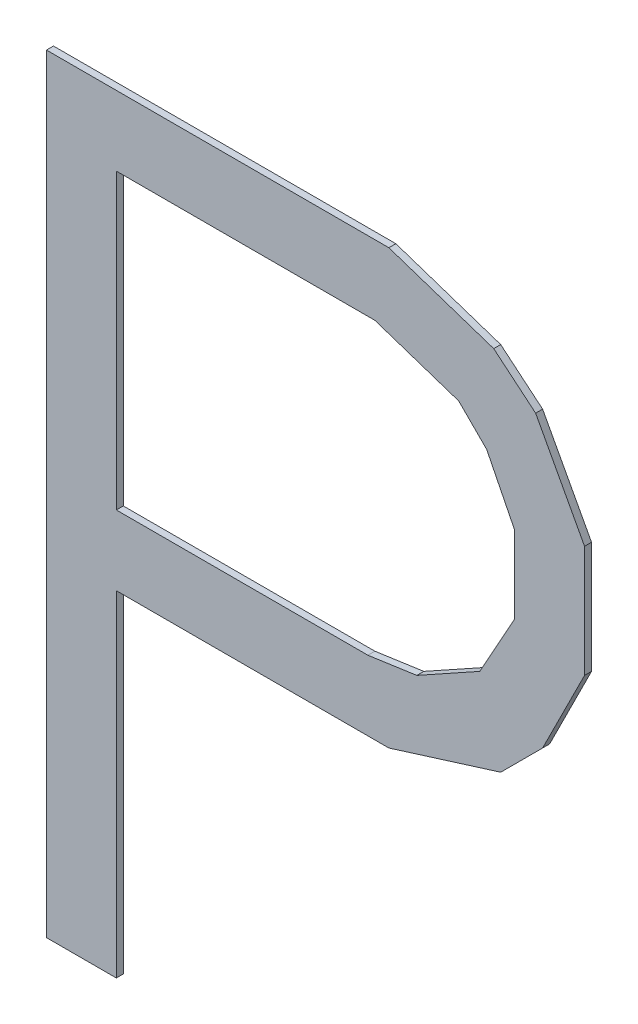
ISO-10303-21;
HEADER;
FILE_DESCRIPTION(('STEP AP214'),'2;1');
FILE_NAME('part.step','',(''),(''),'','','');
FILE_SCHEMA(('AUTOMOTIVE_DESIGN { 1 0 10303 214 1 1 1 1 }'));
ENDSEC;
DATA;
#1=APPLICATION_CONTEXT('core data for automotive mechanical design processes');
#2=APPLICATION_PROTOCOL_DEFINITION('international standard','automotive_design',2000,#1);
#3=PRODUCT_CONTEXT('',#1,'mechanical');
#4=PRODUCT('Part','Part','',(#3));
#5=PRODUCT_RELATED_PRODUCT_CATEGORY('part','',(#4));
#6=PRODUCT_DEFINITION_FORMATION('','',#4);
#7=PRODUCT_DEFINITION_CONTEXT('part definition',#1,'design');
#8=PRODUCT_DEFINITION('design','',#6,#7);
#9=PRODUCT_DEFINITION_SHAPE('','',#8);
#10=(LENGTH_UNIT() NAMED_UNIT(*) SI_UNIT(.MILLI.,.METRE.));
#11=(NAMED_UNIT(*) PLANE_ANGLE_UNIT() SI_UNIT($,.RADIAN.));
#12=(NAMED_UNIT(*) SI_UNIT($,.STERADIAN.) SOLID_ANGLE_UNIT());
#13=UNCERTAINTY_MEASURE_WITH_UNIT(LENGTH_MEASURE(1.E-05),#10,'distance_accuracy_value','');
#14=(GEOMETRIC_REPRESENTATION_CONTEXT(3) GLOBAL_UNCERTAINTY_ASSIGNED_CONTEXT((#13)) GLOBAL_UNIT_ASSIGNED_CONTEXT((#10,
#11,#12)) REPRESENTATION_CONTEXT('',''));
#15=CARTESIAN_POINT('',(0.,0.,0.));
#16=DIRECTION('',(0.,0.,1.));
#17=DIRECTION('',(1.,0.,0.));
#18=AXIS2_PLACEMENT_3D('',#15,#16,#17);
#19=CARTESIAN_POINT('',(-0.28499816,0.03000248000001,0.));
#20=DIRECTION('',(1.,0.,0.));
#21=DIRECTION('',(0.,0.,-1.));
#22=AXIS2_PLACEMENT_3D('',#19,#20,#21);
#23=PLANE('',#22);
#24=DIRECTION('',(0.,0.,1.));
#25=VECTOR('',#24,1.);
#26=CARTESIAN_POINT('',(-0.28499816,-0.06999732,0.));
#27=LINE('',#26,#25);
#28=CARTESIAN_POINT('',(-0.28499816,-0.06999732,0.));
#29=VERTEX_POINT('',#28);
#30=CARTESIAN_POINT('',(-0.28499816,-0.06999732,0.01));
#31=VERTEX_POINT('',#30);
#32=EDGE_CURVE('E189',#29,#31,#27,.T.);
#33=ORIENTED_EDGE('',*,*,#32,.T.);
#34=DIRECTION('',(0.,1.,0.));
#35=VECTOR('',#34,1.);
#36=CARTESIAN_POINT('',(-0.28499816,-0.5499989,0.01));
#37=LINE('',#36,#35);
#38=CARTESIAN_POINT('',(-0.28499816,0.03000248000001,0.01));
#39=VERTEX_POINT('',#38);
#40=EDGE_CURVE('E181',#31,#39,#37,.T.);
#41=ORIENTED_EDGE('',*,*,#40,.T.);
#42=DIRECTION('',(0.,0.,-1.));
#43=VECTOR('',#42,1.);
#44=CARTESIAN_POINT('',(-0.28499816,0.03000248000001,0.));
#45=LINE('',#44,#43);
#46=CARTESIAN_POINT('',(-0.28499816,0.03000248000001,0.));
#47=VERTEX_POINT('',#46);
#48=EDGE_CURVE('E173',#39,#47,#45,.T.);
#49=ORIENTED_EDGE('',*,*,#48,.T.);
#50=DIRECTION('',(0.,1.,0.));
#51=VECTOR('',#50,1.);
#52=CARTESIAN_POINT('',(-0.28499816,-0.5499989,0.));
#53=LINE('',#52,#51);
#54=EDGE_CURVE('E289',#47,#29,#53,.F.);
#55=ORIENTED_EDGE('',*,*,#54,.T.);
#56=EDGE_LOOP('',(#33,#41,#49,#55));
#57=FACE_BOUND('',#56,.T.);
#58=ADVANCED_FACE('F17',(#57),#23,.F.);
#59=CARTESIAN_POINT('',(-0.38499796,-0.5499989,0.01));
#60=DIRECTION('',(0.,0.,-1.));
#61=DIRECTION('',(-1.,0.,0.));
#62=AXIS2_PLACEMENT_3D('',#59,#60,#61);
#63=PLANE('',#62);
#64=DIRECTION('',(-0.707106781186606,-0.707106781186489,0.));
#65=VECTOR('',#64,1.);
#66=CARTESIAN_POINT('',(0.32500062,0.04000245999998,0.01));
#67=LINE('',#66,#65);
#68=CARTESIAN_POINT('',(0.26500074,-0.0199974200000038,0.01));
#69=VERTEX_POINT('',#68);
#70=CARTESIAN_POINT('',(0.325000619999999,0.0400024599999817,0.01));
#71=VERTEX_POINT('',#70);
#72=EDGE_CURVE('E263',#69,#71,#67,.F.);
#73=ORIENTED_EDGE('',*,*,#72,.T.);
#74=DIRECTION('',(-0.447213595499899,-0.894427190999945,0.));
#75=VECTOR('',#74,1.);
#76=CARTESIAN_POINT('',(0.3850005,0.16000222,0.01));
#77=LINE('',#76,#75);
#78=CARTESIAN_POINT('',(0.385000500000002,0.160002219999998,0.01));
#79=VERTEX_POINT('',#78);
#80=EDGE_CURVE('E267',#71,#79,#77,.F.);
#81=ORIENTED_EDGE('',*,*,#80,.T.);
#82=DIRECTION('',(0.,1.,0.));
#83=VECTOR('',#82,1.);
#84=CARTESIAN_POINT('',(0.3850005,-0.5499989,0.01));
#85=LINE('',#84,#83);
#86=CARTESIAN_POINT('',(0.3850005,0.3200019,0.01));
#87=VERTEX_POINT('',#86);
#88=EDGE_CURVE('E270',#79,#87,#85,.T.);
#89=ORIENTED_EDGE('',*,*,#88,.T.);
#90=DIRECTION('',(0.474099823035017,-0.880471099922175,0.));
#91=VECTOR('',#90,1.);
#92=CARTESIAN_POINT('',(0.31500064,0.45000164,0.01));
#93=LINE('',#92,#91);
#94=CARTESIAN_POINT('',(0.315000639999997,0.450001639999999,0.01));
#95=VERTEX_POINT('',#94);
#96=EDGE_CURVE('E273',#87,#95,#93,.F.);
#97=ORIENTED_EDGE('',*,*,#96,.T.);
#98=DIRECTION('',(0.768221279597377,-0.640184399664479,0.));
#99=VECTOR('',#98,1.);
#100=CARTESIAN_POINT('',(0.25500076,0.50000154,0.01));
#101=LINE('',#100,#99);
#102=CARTESIAN_POINT('',(0.255000760000012,0.500001540000008,0.01));
#103=VERTEX_POINT('',#102);
#104=EDGE_CURVE('E276',#95,#103,#101,.F.);
#105=ORIENTED_EDGE('',*,*,#104,.T.);
#106=DIRECTION('',(0.948683298050514,-0.316227766016837,0.));
#107=VECTOR('',#106,1.);
#108=CARTESIAN_POINT('',(0.10500106,0.55000144,0.01));
#109=LINE('',#108,#107);
#110=CARTESIAN_POINT('',(0.10500106,0.55000144,0.01));
#111=VERTEX_POINT('',#110);
#112=EDGE_CURVE('E279',#103,#111,#109,.F.);
#113=ORIENTED_EDGE('',*,*,#112,.T.);
#114=DIRECTION('',(-1.,0.,0.));
#115=VECTOR('',#114,1.);
#116=CARTESIAN_POINT('',(-0.38499796,0.55000144,0.01));
#117=LINE('',#116,#115);
#118=CARTESIAN_POINT('',(-0.38499796,0.55000144,0.01));
#119=VERTEX_POINT('',#118);
#120=EDGE_CURVE('E282',#111,#119,#117,.T.);
#121=ORIENTED_EDGE('',*,*,#120,.T.);
#122=DIRECTION('',(0.,1.,0.));
#123=VECTOR('',#122,1.);
#124=CARTESIAN_POINT('',(-0.38499796,-0.5499989,0.01));
#125=LINE('',#124,#123);
#126=CARTESIAN_POINT('',(-0.38499796,-0.5499989,0.01));
#127=VERTEX_POINT('',#126);
#128=EDGE_CURVE('E285',#119,#127,#125,.F.);
#129=ORIENTED_EDGE('',*,*,#128,.T.);
#130=DIRECTION('',(-1.,0.,0.));
#131=VECTOR('',#130,1.);
#132=CARTESIAN_POINT('',(-0.38499796,-0.5499989,0.01));
#133=LINE('',#132,#131);
#134=CARTESIAN_POINT('',(-0.28499816,-0.5499989,0.01));
#135=VERTEX_POINT('',#134);
#136=EDGE_CURVE('E288',#127,#135,#133,.F.);
#137=ORIENTED_EDGE('',*,*,#136,.T.);
#138=DIRECTION('',(0.,1.,0.));
#139=VECTOR('',#138,1.);
#140=CARTESIAN_POINT('',(-0.28499816,-0.5499989,0.01));
#141=LINE('',#140,#139);
#142=EDGE_CURVE('E190',#135,#31,#141,.T.);
#143=ORIENTED_EDGE('',*,*,#142,.T.);
#144=DIRECTION('',(-1.,0.,0.));
#145=VECTOR('',#144,1.);
#146=CARTESIAN_POINT('',(-0.38499796,-0.06999732,0.01));
#147=LINE('',#146,#145);
#148=CARTESIAN_POINT('',(0.10500106,-0.06999732,0.01));
#149=VERTEX_POINT('',#148);
#150=EDGE_CURVE('E292',#31,#149,#147,.F.);
#151=ORIENTED_EDGE('',*,*,#150,.T.);
#152=DIRECTION('',(-0.954479978035047,-0.298274993135892,0.));
#153=VECTOR('',#152,1.);
#154=CARTESIAN_POINT('',(0.26500074,-0.01999742000001,0.01));
#155=LINE('',#154,#153);
#156=EDGE_CURVE('E260',#149,#69,#155,.F.);
#157=ORIENTED_EDGE('',*,*,#156,.T.);
#158=EDGE_LOOP('',(#73,#81,#89,#97,#105,#113,#121,#129,#137,#143,#151,#157));
#159=FACE_BOUND('',#158,.T.);
#160=DIRECTION('',(-1.,0.,0.));
#161=VECTOR('',#160,1.);
#162=CARTESIAN_POINT('',(-0.38499796,0.45000164,0.01));
#163=LINE('',#162,#161);
#164=CARTESIAN_POINT('',(-0.28499816,0.45000164,0.01));
#165=VERTEX_POINT('',#164);
#166=CARTESIAN_POINT('',(0.0850010999999994,0.45000164,0.01));
#167=VERTEX_POINT('',#166);
#168=EDGE_CURVE('E294',#165,#167,#163,.F.);
#169=ORIENTED_EDGE('',*,*,#168,.T.);
#170=DIRECTION('',(-0.948683298050514,0.316227766016838,0.));
#171=VECTOR('',#170,1.);
#172=CARTESIAN_POINT('',(0.20500086,0.41000172,0.01));
#173=LINE('',#172,#171);
#174=CARTESIAN_POINT('',(0.20500086,0.41000172,0.01));
#175=VERTEX_POINT('',#174);
#176=EDGE_CURVE('E298',#167,#175,#173,.F.);
#177=ORIENTED_EDGE('',*,*,#176,.T.);
#178=DIRECTION('',(-0.707106781186547,0.707106781186547,0.));
#179=VECTOR('',#178,1.);
#180=CARTESIAN_POINT('',(0.24500078,0.3700018,0.01));
#181=LINE('',#180,#179);
#182=CARTESIAN_POINT('',(0.245000779999994,0.37000179999999,0.01));
#183=VERTEX_POINT('',#182);
#184=EDGE_CURVE('E301',#175,#183,#181,.F.);
#185=ORIENTED_EDGE('',*,*,#184,.T.);
#186=DIRECTION('',(-0.447213595499958,0.894427190999916,0.));
#187=VECTOR('',#186,1.);
#188=CARTESIAN_POINT('',(0.2850007,0.29000196,0.01));
#189=LINE('',#188,#187);
#190=CARTESIAN_POINT('',(0.2850007,0.29000196,0.01));
#191=VERTEX_POINT('',#190);
#192=EDGE_CURVE('E304',#183,#191,#189,.F.);
#193=ORIENTED_EDGE('',*,*,#192,.T.);
#194=DIRECTION('',(0.,1.,0.));
#195=VECTOR('',#194,1.);
#196=CARTESIAN_POINT('',(0.2850007,-0.5499989,0.01));
#197=LINE('',#196,#195);
#198=CARTESIAN_POINT('',(0.2850007,0.18000218,0.01));
#199=VERTEX_POINT('',#198);
#200=EDGE_CURVE('E307',#191,#199,#197,.F.);
#201=ORIENTED_EDGE('',*,*,#200,.T.);
#202=DIRECTION('',(0.485642931178631,0.874157276121538,0.));
#203=VECTOR('',#202,1.);
#204=CARTESIAN_POINT('',(0.2350008,0.09000236,0.01));
#205=LINE('',#204,#203);
#206=CARTESIAN_POINT('',(0.23500079999998,0.0900023600000034,0.01));
#207=VERTEX_POINT('',#206);
#208=EDGE_CURVE('E310',#199,#207,#205,.F.);
#209=ORIENTED_EDGE('',*,*,#208,.T.);
#210=DIRECTION('',(0.874157276121455,0.48564293117878,0.));
#211=VECTOR('',#210,1.);
#212=CARTESIAN_POINT('',(0.14500098,0.04000245999998,0.01));
#213=LINE('',#212,#211);
#214=CARTESIAN_POINT('',(0.145000980000009,0.0400024599999712,0.01));
#215=VERTEX_POINT('',#214);
#216=EDGE_CURVE('E313',#207,#215,#213,.F.);
#217=ORIENTED_EDGE('',*,*,#216,.T.);
#218=DIRECTION('',(0.989949493661226,0.141421356236893,0.));
#219=VECTOR('',#218,1.);
#220=CARTESIAN_POINT('',(0.07500112,0.03000248000001,0.01));
#221=LINE('',#220,#219);
#222=CARTESIAN_POINT('',(0.0750011200000007,0.0300024800000076,0.01));
#223=VERTEX_POINT('',#222);
#224=EDGE_CURVE('E164',#215,#223,#221,.F.);
#225=ORIENTED_EDGE('',*,*,#224,.T.);
#226=DIRECTION('',(-1.,0.,0.));
#227=VECTOR('',#226,1.);
#228=CARTESIAN_POINT('',(-0.38499796,0.03000248000001,0.01));
#229=LINE('',#228,#227);
#230=EDGE_CURVE('E20',#223,#39,#229,.T.);
#231=ORIENTED_EDGE('',*,*,#230,.T.);
#232=DIRECTION('',(0.,1.,0.));
#233=VECTOR('',#232,1.);
#234=CARTESIAN_POINT('',(-0.28499816,-0.5499989,0.01));
#235=LINE('',#234,#233);
#236=EDGE_CURVE('E168',#39,#165,#235,.T.);
#237=ORIENTED_EDGE('',*,*,#236,.T.);
#238=EDGE_LOOP('',(#169,#177,#185,#193,#201,#209,#217,#225,#231,#237));
#239=FACE_BOUND('',#238,.T.);
#240=ADVANCED_FACE('F167',(#159,#239),#63,.F.);
#241=CARTESIAN_POINT('',(0.07500112,0.03000248000001,0.));
#242=DIRECTION('',(0.,-1.,0.));
#243=DIRECTION('',(0.,0.,-1.));
#244=AXIS2_PLACEMENT_3D('',#241,#242,#243);
#245=PLANE('',#244);
#246=ORIENTED_EDGE('',*,*,#48,.F.);
#247=ORIENTED_EDGE('',*,*,#230,.F.);
#248=DIRECTION('',(0.,0.,1.));
#249=VECTOR('',#248,1.);
#250=CARTESIAN_POINT('',(0.0750011200000014,0.0300024800000004,0.));
#251=LINE('',#250,#249);
#252=CARTESIAN_POINT('',(0.0750011200000007,0.0300024800000076,0.));
#253=VERTEX_POINT('',#252);
#254=EDGE_CURVE('E196',#223,#253,#251,.F.);
#255=ORIENTED_EDGE('',*,*,#254,.T.);
#256=DIRECTION('',(-1.,0.,0.));
#257=VECTOR('',#256,1.);
#258=CARTESIAN_POINT('',(-0.38499796,0.03000248000001,0.));
#259=LINE('',#258,#257);
#260=EDGE_CURVE('E194',#47,#253,#259,.F.);
#261=ORIENTED_EDGE('',*,*,#260,.F.);
#262=EDGE_LOOP('',(#246,#247,#255,#261));
#263=FACE_BOUND('',#262,.T.);
#264=ADVANCED_FACE('F192',(#263),#245,.F.);
#265=CARTESIAN_POINT('',(0.14500098,0.04000245999998,0.));
#266=DIRECTION('',(0.14142135623703,-0.989949493661207,0.));
#267=DIRECTION('',(0.989949493661207,0.14142135623703,0.));
#268=AXIS2_PLACEMENT_3D('',#265,#266,#267);
#269=PLANE('',#268);
#270=ORIENTED_EDGE('',*,*,#254,.F.);
#271=ORIENTED_EDGE('',*,*,#224,.F.);
#272=DIRECTION('',(0.,0.,1.));
#273=VECTOR('',#272,1.);
#274=CARTESIAN_POINT('',(0.145000980000021,0.0400024599999428,0.));
#275=LINE('',#274,#273);
#276=CARTESIAN_POINT('',(0.145000980000009,0.0400024599999712,0.));
#277=VERTEX_POINT('',#276);
#278=EDGE_CURVE('E312',#215,#277,#275,.F.);
#279=ORIENTED_EDGE('',*,*,#278,.T.);
#280=DIRECTION('',(0.989949493661226,0.141421356236893,0.));
#281=VECTOR('',#280,1.);
#282=CARTESIAN_POINT('',(0.07500112,0.03000248000001,0.));
#283=LINE('',#282,#281);
#284=EDGE_CURVE('E256',#253,#277,#283,.T.);
#285=ORIENTED_EDGE('',*,*,#284,.F.);
#286=EDGE_LOOP('',(#270,#271,#279,#285));
#287=FACE_BOUND('',#286,.T.);
#288=ADVANCED_FACE('F317',(#287),#269,.F.);
#289=CARTESIAN_POINT('',(0.2350008,0.09000236,0.));
#290=DIRECTION('',(0.485642931179142,-0.874157276121255,0.));
#291=DIRECTION('',(0.874157276121255,0.485642931179142,0.));
#292=AXIS2_PLACEMENT_3D('',#289,#290,#291);
#293=PLANE('',#292);
#294=ORIENTED_EDGE('',*,*,#278,.F.);
#295=ORIENTED_EDGE('',*,*,#216,.F.);
#296=DIRECTION('',(0.,0.,1.));
#297=VECTOR('',#296,1.);
#298=CARTESIAN_POINT('',(0.235000799999948,0.0900023600000291,0.));
#299=LINE('',#298,#297);
#300=CARTESIAN_POINT('',(0.23500079999998,0.0900023600000034,0.));
#301=VERTEX_POINT('',#300);
#302=EDGE_CURVE('E309',#207,#301,#299,.F.);
#303=ORIENTED_EDGE('',*,*,#302,.T.);
#304=DIRECTION('',(0.874157276121455,0.48564293117878,0.));
#305=VECTOR('',#304,1.);
#306=CARTESIAN_POINT('',(0.14500098,0.04000245999998,0.));
#307=LINE('',#306,#305);
#308=EDGE_CURVE('E253',#277,#301,#307,.T.);
#309=ORIENTED_EDGE('',*,*,#308,.F.);
#310=EDGE_LOOP('',(#294,#295,#303,#309));
#311=FACE_BOUND('',#310,.T.);
#312=ADVANCED_FACE('F338',(#311),#293,.F.);
#313=CARTESIAN_POINT('',(0.2850007,0.18000218,0.));
#314=DIRECTION('',(0.874157276121255,-0.485642931179142,0.));
#315=DIRECTION('',(0.485642931179142,0.874157276121255,0.));
#316=AXIS2_PLACEMENT_3D('',#313,#314,#315);
#317=PLANE('',#316);
#318=ORIENTED_EDGE('',*,*,#302,.F.);
#319=ORIENTED_EDGE('',*,*,#208,.F.);
#320=DIRECTION('',(0.,0.,-1.));
#321=VECTOR('',#320,1.);
#322=CARTESIAN_POINT('',(0.2850007,0.18000218,0.));
#323=LINE('',#322,#321);
#324=CARTESIAN_POINT('',(0.2850007,0.18000218,0.));
#325=VERTEX_POINT('',#324);
#326=EDGE_CURVE('E306',#199,#325,#323,.T.);
#327=ORIENTED_EDGE('',*,*,#326,.T.);
#328=DIRECTION('',(0.485642931178631,0.874157276121538,0.));
#329=VECTOR('',#328,1.);
#330=CARTESIAN_POINT('',(0.2350008,0.09000236,0.));
#331=LINE('',#330,#329);
#332=EDGE_CURVE('E250',#301,#325,#331,.T.);
#333=ORIENTED_EDGE('',*,*,#332,.F.);
#334=EDGE_LOOP('',(#318,#319,#327,#333));
#335=FACE_BOUND('',#334,.T.);
#336=ADVANCED_FACE('F341',(#335),#317,.F.);
#337=CARTESIAN_POINT('',(0.2850007,0.29000196,0.));
#338=DIRECTION('',(1.,0.,0.));
#339=DIRECTION('',(0.,0.,-1.));
#340=AXIS2_PLACEMENT_3D('',#337,#338,#339);
#341=PLANE('',#340);
#342=ORIENTED_EDGE('',*,*,#326,.F.);
#343=ORIENTED_EDGE('',*,*,#200,.F.);
#344=DIRECTION('',(0.,0.,1.));
#345=VECTOR('',#344,1.);
#346=CARTESIAN_POINT('',(0.2850007,0.29000196,0.));
#347=LINE('',#346,#345);
#348=CARTESIAN_POINT('',(0.2850007,0.29000196,0.));
#349=VERTEX_POINT('',#348);
#350=EDGE_CURVE('E303',#191,#349,#347,.F.);
#351=ORIENTED_EDGE('',*,*,#350,.T.);
#352=DIRECTION('',(0.,1.,0.));
#353=VECTOR('',#352,1.);
#354=CARTESIAN_POINT('',(0.2850007,-0.5499989,0.));
#355=LINE('',#354,#353);
#356=EDGE_CURVE('E247',#325,#349,#355,.T.);
#357=ORIENTED_EDGE('',*,*,#356,.F.);
#358=EDGE_LOOP('',(#342,#343,#351,#357));
#359=FACE_BOUND('',#358,.T.);
#360=ADVANCED_FACE('F346',(#359),#341,.F.);
#361=CARTESIAN_POINT('',(0.24500078,0.3700018,0.));
#362=DIRECTION('',(0.894427190999916,0.447213595499958,0.));
#363=DIRECTION('',(-0.447213595499958,0.894427190999916,0.));
#364=AXIS2_PLACEMENT_3D('',#361,#362,#363);
#365=PLANE('',#364);
#366=ORIENTED_EDGE('',*,*,#350,.F.);
#367=ORIENTED_EDGE('',*,*,#192,.F.);
#368=DIRECTION('',(0.,0.,1.));
#369=VECTOR('',#368,1.);
#370=CARTESIAN_POINT('',(0.245000779999972,0.370001799999972,0.));
#371=LINE('',#370,#369);
#372=CARTESIAN_POINT('',(0.245000779999994,0.37000179999999,0.));
#373=VERTEX_POINT('',#372);
#374=EDGE_CURVE('E300',#183,#373,#371,.F.);
#375=ORIENTED_EDGE('',*,*,#374,.T.);
#376=DIRECTION('',(-0.447213595499958,0.894427190999916,0.));
#377=VECTOR('',#376,1.);
#378=CARTESIAN_POINT('',(0.2850007,0.29000196,0.));
#379=LINE('',#378,#377);
#380=EDGE_CURVE('E244',#349,#373,#379,.T.);
#381=ORIENTED_EDGE('',*,*,#380,.F.);
#382=EDGE_LOOP('',(#366,#367,#375,#381));
#383=FACE_BOUND('',#382,.T.);
#384=ADVANCED_FACE('F351',(#383),#365,.F.);
#385=CARTESIAN_POINT('',(0.20500086,0.41000172,0.));
#386=DIRECTION('',(0.707106781187048,0.707106781186048,0.));
#387=DIRECTION('',(-0.707106781186048,0.707106781187048,0.));
#388=AXIS2_PLACEMENT_3D('',#385,#386,#387);
#389=PLANE('',#388);
#390=ORIENTED_EDGE('',*,*,#374,.F.);
#391=ORIENTED_EDGE('',*,*,#184,.F.);
#392=DIRECTION('',(0.,0.,1.));
#393=VECTOR('',#392,1.);
#394=CARTESIAN_POINT('',(0.20500086,0.41000172,0.));
#395=LINE('',#394,#393);
#396=CARTESIAN_POINT('',(0.20500086,0.41000172,0.));
#397=VERTEX_POINT('',#396);
#398=EDGE_CURVE('E297',#175,#397,#395,.F.);
#399=ORIENTED_EDGE('',*,*,#398,.T.);
#400=DIRECTION('',(-0.707106781186547,0.707106781186547,0.));
#401=VECTOR('',#400,1.);
#402=CARTESIAN_POINT('',(0.24500078,0.3700018,0.));
#403=LINE('',#402,#401);
#404=EDGE_CURVE('E241',#373,#397,#403,.T.);
#405=ORIENTED_EDGE('',*,*,#404,.F.);
#406=EDGE_LOOP('',(#390,#391,#399,#405));
#407=FACE_BOUND('',#406,.T.);
#408=ADVANCED_FACE('F356',(#407),#389,.F.);
#409=CARTESIAN_POINT('',(0.0850011,0.45000164,0.));
#410=DIRECTION('',(0.316227766016838,0.948683298050514,0.));
#411=DIRECTION('',(-0.948683298050514,0.316227766016838,0.));
#412=AXIS2_PLACEMENT_3D('',#409,#410,#411);
#413=PLANE('',#412);
#414=ORIENTED_EDGE('',*,*,#398,.F.);
#415=ORIENTED_EDGE('',*,*,#176,.F.);
#416=DIRECTION('',(0.,0.,1.));
#417=VECTOR('',#416,1.);
#418=CARTESIAN_POINT('',(0.0850011,0.45000164,0.));
#419=LINE('',#418,#417);
#420=CARTESIAN_POINT('',(0.0850010999999994,0.45000164,0.));
#421=VERTEX_POINT('',#420);
#422=EDGE_CURVE('E296',#167,#421,#419,.F.);
#423=ORIENTED_EDGE('',*,*,#422,.T.);
#424=DIRECTION('',(-0.948683298050514,0.316227766016838,0.));
#425=VECTOR('',#424,1.);
#426=CARTESIAN_POINT('',(0.20500086,0.41000172,0.));
#427=LINE('',#426,#425);
#428=EDGE_CURVE('E238',#397,#421,#427,.T.);
#429=ORIENTED_EDGE('',*,*,#428,.F.);
#430=EDGE_LOOP('',(#414,#415,#423,#429));
#431=FACE_BOUND('',#430,.T.);
#432=ADVANCED_FACE('F360',(#431),#413,.F.);
#433=CARTESIAN_POINT('',(-0.28499816,0.45000164,0.));
#434=DIRECTION('',(0.,1.,0.));
#435=DIRECTION('',(0.,0.,1.));
#436=AXIS2_PLACEMENT_3D('',#433,#434,#435);
#437=PLANE('',#436);
#438=ORIENTED_EDGE('',*,*,#422,.F.);
#439=ORIENTED_EDGE('',*,*,#168,.F.);
#440=DIRECTION('',(0.,0.,1.));
#441=VECTOR('',#440,1.);
#442=CARTESIAN_POINT('',(-0.28499816,0.45000164,0.));
#443=LINE('',#442,#441);
#444=CARTESIAN_POINT('',(-0.28499816,0.45000164,0.));
#445=VERTEX_POINT('',#444);
#446=EDGE_CURVE('E184',#165,#445,#443,.F.);
#447=ORIENTED_EDGE('',*,*,#446,.T.);
#448=DIRECTION('',(-1.,0.,0.));
#449=VECTOR('',#448,1.);
#450=CARTESIAN_POINT('',(-0.38499796,0.45000164,0.));
#451=LINE('',#450,#449);
#452=EDGE_CURVE('E235',#421,#445,#451,.T.);
#453=ORIENTED_EDGE('',*,*,#452,.F.);
#454=EDGE_LOOP('',(#438,#439,#447,#453));
#455=FACE_BOUND('',#454,.T.);
#456=ADVANCED_FACE('F364',(#455),#437,.F.);
#457=CARTESIAN_POINT('',(-0.28499816,-0.06999732,0.));
#458=DIRECTION('',(0.,1.,0.));
#459=DIRECTION('',(0.,0.,1.));
#460=AXIS2_PLACEMENT_3D('',#457,#458,#459);
#461=PLANE('',#460);
#462=DIRECTION('',(0.,0.,1.));
#463=VECTOR('',#462,1.);
#464=CARTESIAN_POINT('',(0.10500106,-0.06999732,0.));
#465=LINE('',#464,#463);
#466=CARTESIAN_POINT('',(0.10500106,-0.06999732,0.));
#467=VERTEX_POINT('',#466);
#468=EDGE_CURVE('E262',#467,#149,#465,.T.);
#469=ORIENTED_EDGE('',*,*,#468,.T.);
#470=ORIENTED_EDGE('',*,*,#150,.F.);
#471=ORIENTED_EDGE('',*,*,#32,.F.);
#472=DIRECTION('',(-1.,0.,0.));
#473=VECTOR('',#472,1.);
#474=CARTESIAN_POINT('',(-0.38499796,-0.06999732,0.));
#475=LINE('',#474,#473);
#476=EDGE_CURVE('E229',#467,#29,#475,.T.);
#477=ORIENTED_EDGE('',*,*,#476,.F.);
#478=EDGE_LOOP('',(#469,#470,#471,#477));
#479=FACE_BOUND('',#478,.T.);
#480=ADVANCED_FACE('F366',(#479),#461,.F.);
#481=CARTESIAN_POINT('',(-0.28499816,-0.5499989,0.));
#482=DIRECTION('',(-1.,0.,0.));
#483=DIRECTION('',(0.,0.,1.));
#484=AXIS2_PLACEMENT_3D('',#481,#482,#483);
#485=PLANE('',#484);
#486=ORIENTED_EDGE('',*,*,#54,.F.);
#487=DIRECTION('',(0.,1.,0.));
#488=VECTOR('',#487,1.);
#489=CARTESIAN_POINT('',(-0.28499816,-0.5499989,0.));
#490=LINE('',#489,#488);
#491=EDGE_CURVE('E232',#445,#47,#490,.F.);
#492=ORIENTED_EDGE('',*,*,#491,.F.);
#493=ORIENTED_EDGE('',*,*,#446,.F.);
#494=ORIENTED_EDGE('',*,*,#236,.F.);
#495=ORIENTED_EDGE('',*,*,#40,.F.);
#496=ORIENTED_EDGE('',*,*,#142,.F.);
#497=DIRECTION('',(0.,0.,1.));
#498=VECTOR('',#497,1.);
#499=CARTESIAN_POINT('',(-0.28499816,-0.5499989,0.));
#500=LINE('',#499,#498);
#501=CARTESIAN_POINT('',(-0.28499816,-0.5499989,0.));
#502=VERTEX_POINT('',#501);
#503=EDGE_CURVE('E287',#135,#502,#500,.F.);
#504=ORIENTED_EDGE('',*,*,#503,.T.);
#505=DIRECTION('',(0.,1.,0.));
#506=VECTOR('',#505,1.);
#507=CARTESIAN_POINT('',(-0.28499816,-0.5499989,0.));
#508=LINE('',#507,#506);
#509=EDGE_CURVE('E226',#29,#502,#508,.F.);
#510=ORIENTED_EDGE('',*,*,#509,.F.);
#511=EDGE_LOOP('',(#486,#492,#493,#494,#495,#496,#504,#510));
#512=FACE_BOUND('',#511,.T.);
#513=ADVANCED_FACE('F179',(#512),#485,.F.);
#514=CARTESIAN_POINT('',(-0.38499796,-0.5499989,0.));
#515=DIRECTION('',(0.,1.,0.));
#516=DIRECTION('',(0.,0.,1.));
#517=AXIS2_PLACEMENT_3D('',#514,#515,#516);
#518=PLANE('',#517);
#519=ORIENTED_EDGE('',*,*,#503,.F.);
#520=ORIENTED_EDGE('',*,*,#136,.F.);
#521=DIRECTION('',(0.,0.,-1.));
#522=VECTOR('',#521,1.);
#523=CARTESIAN_POINT('',(-0.38499796,-0.5499989,0.));
#524=LINE('',#523,#522);
#525=CARTESIAN_POINT('',(-0.38499796,-0.5499989,0.));
#526=VERTEX_POINT('',#525);
#527=EDGE_CURVE('E284',#127,#526,#524,.T.);
#528=ORIENTED_EDGE('',*,*,#527,.T.);
#529=DIRECTION('',(-1.,0.,0.));
#530=VECTOR('',#529,1.);
#531=CARTESIAN_POINT('',(-0.38499796,-0.5499989,0.));
#532=LINE('',#531,#530);
#533=EDGE_CURVE('E223',#502,#526,#532,.T.);
#534=ORIENTED_EDGE('',*,*,#533,.F.);
#535=EDGE_LOOP('',(#519,#520,#528,#534));
#536=FACE_BOUND('',#535,.T.);
#537=ADVANCED_FACE('F416',(#536),#518,.F.);
#538=CARTESIAN_POINT('',(-0.38499796,0.55000144,0.));
#539=DIRECTION('',(1.,0.,0.));
#540=DIRECTION('',(0.,0.,-1.));
#541=AXIS2_PLACEMENT_3D('',#538,#539,#540);
#542=PLANE('',#541);
#543=ORIENTED_EDGE('',*,*,#527,.F.);
#544=ORIENTED_EDGE('',*,*,#128,.F.);
#545=DIRECTION('',(0.,0.,-1.));
#546=VECTOR('',#545,1.);
#547=CARTESIAN_POINT('',(-0.38499796,0.55000144,0.));
#548=LINE('',#547,#546);
#549=CARTESIAN_POINT('',(-0.38499796,0.55000144,0.));
#550=VERTEX_POINT('',#549);
#551=EDGE_CURVE('E281',#119,#550,#548,.T.);
#552=ORIENTED_EDGE('',*,*,#551,.T.);
#553=DIRECTION('',(0.,1.,0.));
#554=VECTOR('',#553,1.);
#555=CARTESIAN_POINT('',(-0.38499796,-0.5499989,0.));
#556=LINE('',#555,#554);
#557=EDGE_CURVE('E220',#526,#550,#556,.T.);
#558=ORIENTED_EDGE('',*,*,#557,.F.);
#559=EDGE_LOOP('',(#543,#544,#552,#558));
#560=FACE_BOUND('',#559,.T.);
#561=ADVANCED_FACE('F412',(#560),#542,.F.);
#562=CARTESIAN_POINT('',(0.10500106,0.55000144,0.));
#563=DIRECTION('',(0.,-1.,0.));
#564=DIRECTION('',(0.,0.,-1.));
#565=AXIS2_PLACEMENT_3D('',#562,#563,#564);
#566=PLANE('',#565);
#567=ORIENTED_EDGE('',*,*,#551,.F.);
#568=ORIENTED_EDGE('',*,*,#120,.F.);
#569=DIRECTION('',(0.,0.,1.));
#570=VECTOR('',#569,1.);
#571=CARTESIAN_POINT('',(0.10500106,0.55000144,0.));
#572=LINE('',#571,#570);
#573=CARTESIAN_POINT('',(0.10500106,0.55000144,0.));
#574=VERTEX_POINT('',#573);
#575=EDGE_CURVE('E278',#111,#574,#572,.F.);
#576=ORIENTED_EDGE('',*,*,#575,.T.);
#577=DIRECTION('',(-1.,0.,0.));
#578=VECTOR('',#577,1.);
#579=CARTESIAN_POINT('',(-0.38499796,0.55000144,0.));
#580=LINE('',#579,#578);
#581=EDGE_CURVE('E217',#550,#574,#580,.F.);
#582=ORIENTED_EDGE('',*,*,#581,.F.);
#583=EDGE_LOOP('',(#567,#568,#576,#582));
#584=FACE_BOUND('',#583,.T.);
#585=ADVANCED_FACE('F408',(#584),#566,.F.);
#586=CARTESIAN_POINT('',(0.25500076,0.50000154,0.));
#587=DIRECTION('',(-0.316227766016838,-0.948683298050514,0.));
#588=DIRECTION('',(0.948683298050514,-0.316227766016838,0.));
#589=AXIS2_PLACEMENT_3D('',#586,#587,#588);
#590=PLANE('',#589);
#591=ORIENTED_EDGE('',*,*,#575,.F.);
#592=ORIENTED_EDGE('',*,*,#112,.F.);
#593=DIRECTION('',(0.,0.,1.));
#594=VECTOR('',#593,1.);
#595=CARTESIAN_POINT('',(0.255000760000032,0.500001540000038,0.));
#596=LINE('',#595,#594);
#597=CARTESIAN_POINT('',(0.255000760000012,0.500001540000008,0.));
#598=VERTEX_POINT('',#597);
#599=EDGE_CURVE('E275',#103,#598,#596,.F.);
#600=ORIENTED_EDGE('',*,*,#599,.T.);
#601=DIRECTION('',(0.948683298050514,-0.316227766016837,0.));
#602=VECTOR('',#601,1.);
#603=CARTESIAN_POINT('',(0.10500106,0.55000144,0.));
#604=LINE('',#603,#602);
#605=EDGE_CURVE('E214',#574,#598,#604,.T.);
#606=ORIENTED_EDGE('',*,*,#605,.F.);
#607=EDGE_LOOP('',(#591,#592,#600,#606));
#608=FACE_BOUND('',#607,.T.);
#609=ADVANCED_FACE('F404',(#608),#590,.F.);
#610=CARTESIAN_POINT('',(0.31500064,0.45000164,0.));
#611=DIRECTION('',(-0.640184399664972,-0.768221279596966,0.));
#612=DIRECTION('',(0.768221279596966,-0.640184399664972,0.));
#613=AXIS2_PLACEMENT_3D('',#610,#611,#612);
#614=PLANE('',#613);
#615=ORIENTED_EDGE('',*,*,#599,.F.);
#616=ORIENTED_EDGE('',*,*,#104,.F.);
#617=DIRECTION('',(0.,0.,1.));
#618=VECTOR('',#617,1.);
#619=CARTESIAN_POINT('',(0.315000639999991,0.450001639999995,0.));
#620=LINE('',#619,#618);
#621=CARTESIAN_POINT('',(0.315000639999997,0.450001639999999,0.));
#622=VERTEX_POINT('',#621);
#623=EDGE_CURVE('E272',#95,#622,#620,.F.);
#624=ORIENTED_EDGE('',*,*,#623,.T.);
#625=DIRECTION('',(0.768221279597377,-0.640184399664479,0.));
#626=VECTOR('',#625,1.);
#627=CARTESIAN_POINT('',(0.25500076,0.50000154,0.));
#628=LINE('',#627,#626);
#629=EDGE_CURVE('E211',#598,#622,#628,.T.);
#630=ORIENTED_EDGE('',*,*,#629,.F.);
#631=EDGE_LOOP('',(#615,#616,#624,#630));
#632=FACE_BOUND('',#631,.T.);
#633=ADVANCED_FACE('F400',(#632),#614,.F.);
#634=CARTESIAN_POINT('',(0.3850005,0.3200019,0.));
#635=DIRECTION('',(-0.880471099922143,-0.474099823035077,0.));
#636=DIRECTION('',(0.474099823035077,-0.880471099922143,0.));
#637=AXIS2_PLACEMENT_3D('',#634,#635,#636);
#638=PLANE('',#637);
#639=ORIENTED_EDGE('',*,*,#623,.F.);
#640=ORIENTED_EDGE('',*,*,#96,.F.);
#641=DIRECTION('',(0.,0.,1.));
#642=VECTOR('',#641,1.);
#643=CARTESIAN_POINT('',(0.3850005,0.3200019,0.));
#644=LINE('',#643,#642);
#645=CARTESIAN_POINT('',(0.3850005,0.3200019,0.));
#646=VERTEX_POINT('',#645);
#647=EDGE_CURVE('E269',#87,#646,#644,.F.);
#648=ORIENTED_EDGE('',*,*,#647,.T.);
#649=DIRECTION('',(0.474099823035017,-0.880471099922175,0.));
#650=VECTOR('',#649,1.);
#651=CARTESIAN_POINT('',(0.31500064,0.45000164,0.));
#652=LINE('',#651,#650);
#653=EDGE_CURVE('E208',#622,#646,#652,.T.);
#654=ORIENTED_EDGE('',*,*,#653,.F.);
#655=EDGE_LOOP('',(#639,#640,#648,#654));
#656=FACE_BOUND('',#655,.T.);
#657=ADVANCED_FACE('F396',(#656),#638,.F.);
#658=CARTESIAN_POINT('',(0.3850005,0.16000222,0.));
#659=DIRECTION('',(-1.,0.,0.));
#660=DIRECTION('',(0.,0.,1.));
#661=AXIS2_PLACEMENT_3D('',#658,#659,#660);
#662=PLANE('',#661);
#663=ORIENTED_EDGE('',*,*,#647,.F.);
#664=ORIENTED_EDGE('',*,*,#88,.F.);
#665=DIRECTION('',(0.,0.,1.));
#666=VECTOR('',#665,1.);
#667=CARTESIAN_POINT('',(0.385000500000008,0.160002219999996,0.));
#668=LINE('',#667,#666);
#669=CARTESIAN_POINT('',(0.385000500000002,0.160002219999998,0.));
#670=VERTEX_POINT('',#669);
#671=EDGE_CURVE('E266',#79,#670,#668,.F.);
#672=ORIENTED_EDGE('',*,*,#671,.T.);
#673=DIRECTION('',(0.,1.,0.));
#674=VECTOR('',#673,1.);
#675=CARTESIAN_POINT('',(0.3850005,-0.5499989,0.));
#676=LINE('',#675,#674);
#677=EDGE_CURVE('E205',#646,#670,#676,.F.);
#678=ORIENTED_EDGE('',*,*,#677,.F.);
#679=EDGE_LOOP('',(#663,#664,#672,#678));
#680=FACE_BOUND('',#679,.T.);
#681=ADVANCED_FACE('F392',(#680),#662,.F.);
#682=CARTESIAN_POINT('',(0.32500062,0.04000245999998,0.));
#683=DIRECTION('',(-0.894427190999916,0.447213595499958,0.));
#684=DIRECTION('',(-0.447213595499958,-0.894427190999916,0.));
#685=AXIS2_PLACEMENT_3D('',#682,#683,#684);
#686=PLANE('',#685);
#687=ORIENTED_EDGE('',*,*,#671,.F.);
#688=ORIENTED_EDGE('',*,*,#80,.F.);
#689=DIRECTION('',(0.,0.,1.));
#690=VECTOR('',#689,1.);
#691=CARTESIAN_POINT('',(0.325000619999995,0.040002459999985,0.));
#692=LINE('',#691,#690);
#693=CARTESIAN_POINT('',(0.325000619999999,0.0400024599999816,0.));
#694=VERTEX_POINT('',#693);
#695=EDGE_CURVE('E265',#71,#694,#692,.F.);
#696=ORIENTED_EDGE('',*,*,#695,.T.);
#697=DIRECTION('',(-0.447213595499899,-0.894427190999945,0.));
#698=VECTOR('',#697,1.);
#699=CARTESIAN_POINT('',(0.3850005,0.16000222,0.));
#700=LINE('',#699,#698);
#701=EDGE_CURVE('E202',#670,#694,#700,.T.);
#702=ORIENTED_EDGE('',*,*,#701,.F.);
#703=EDGE_LOOP('',(#687,#688,#696,#702));
#704=FACE_BOUND('',#703,.T.);
#705=ADVANCED_FACE('F389',(#704),#686,.F.);
#706=CARTESIAN_POINT('',(0.26500074,-0.01999742000001,0.));
#707=DIRECTION('',(-0.707106781186548,0.707106781186548,0.));
#708=DIRECTION('',(-0.707106781186548,-0.707106781186548,0.));
#709=AXIS2_PLACEMENT_3D('',#706,#707,#708);
#710=PLANE('',#709);
#711=ORIENTED_EDGE('',*,*,#695,.F.);
#712=ORIENTED_EDGE('',*,*,#72,.F.);
#713=DIRECTION('',(0.,0.,1.));
#714=VECTOR('',#713,1.);
#715=CARTESIAN_POINT('',(0.265000739999994,-0.0199974199999914,0.));
#716=LINE('',#715,#714);
#717=CARTESIAN_POINT('',(0.26500074,-0.0199974200000038,0.));
#718=VERTEX_POINT('',#717);
#719=EDGE_CURVE('E35',#69,#718,#716,.F.);
#720=ORIENTED_EDGE('',*,*,#719,.T.);
#721=DIRECTION('',(-0.707106781186606,-0.707106781186489,0.));
#722=VECTOR('',#721,1.);
#723=CARTESIAN_POINT('',(0.32500062,0.04000245999998,0.));
#724=LINE('',#723,#722);
#725=EDGE_CURVE('E26',#694,#718,#724,.T.);
#726=ORIENTED_EDGE('',*,*,#725,.F.);
#727=EDGE_LOOP('',(#711,#712,#720,#726));
#728=FACE_BOUND('',#727,.T.);
#729=ADVANCED_FACE('F383',(#728),#710,.F.);
#730=CARTESIAN_POINT('',(0.10500106,-0.06999732,0.));
#731=DIRECTION('',(-0.298274993136004,0.954479978035012,0.));
#732=DIRECTION('',(-0.954479978035012,-0.298274993136004,0.));
#733=AXIS2_PLACEMENT_3D('',#730,#731,#732);
#734=PLANE('',#733);
#735=ORIENTED_EDGE('',*,*,#719,.F.);
#736=ORIENTED_EDGE('',*,*,#156,.F.);
#737=ORIENTED_EDGE('',*,*,#468,.F.);
#738=DIRECTION('',(-0.954479978035047,-0.298274993135892,0.));
#739=VECTOR('',#738,1.);
#740=CARTESIAN_POINT('',(0.26500074,-0.01999742000001,0.));
#741=LINE('',#740,#739);
#742=EDGE_CURVE('E11',#718,#467,#741,.T.);
#743=ORIENTED_EDGE('',*,*,#742,.F.);
#744=EDGE_LOOP('',(#735,#736,#737,#743));
#745=FACE_BOUND('',#744,.T.);
#746=ADVANCED_FACE('F377',(#745),#734,.F.);
#747=CARTESIAN_POINT('',(-0.38499796,-0.5499989,0.));
#748=DIRECTION('',(0.,0.,-1.));
#749=DIRECTION('',(-1.,0.,0.));
#750=AXIS2_PLACEMENT_3D('',#747,#748,#749);
#751=PLANE('',#750);
#752=ORIENTED_EDGE('',*,*,#725,.T.);
#753=ORIENTED_EDGE('',*,*,#742,.T.);
#754=ORIENTED_EDGE('',*,*,#476,.T.);
#755=ORIENTED_EDGE('',*,*,#509,.T.);
#756=ORIENTED_EDGE('',*,*,#533,.T.);
#757=ORIENTED_EDGE('',*,*,#557,.T.);
#758=ORIENTED_EDGE('',*,*,#581,.T.);
#759=ORIENTED_EDGE('',*,*,#605,.T.);
#760=ORIENTED_EDGE('',*,*,#629,.T.);
#761=ORIENTED_EDGE('',*,*,#653,.T.);
#762=ORIENTED_EDGE('',*,*,#677,.T.);
#763=ORIENTED_EDGE('',*,*,#701,.T.);
#764=EDGE_LOOP('',(#752,#753,#754,#755,#756,#757,#758,#759,#760,#761,#762,#763));
#765=FACE_BOUND('',#764,.T.);
#766=ORIENTED_EDGE('',*,*,#452,.T.);
#767=ORIENTED_EDGE('',*,*,#491,.T.);
#768=ORIENTED_EDGE('',*,*,#260,.T.);
#769=ORIENTED_EDGE('',*,*,#284,.T.);
#770=ORIENTED_EDGE('',*,*,#308,.T.);
#771=ORIENTED_EDGE('',*,*,#332,.T.);
#772=ORIENTED_EDGE('',*,*,#356,.T.);
#773=ORIENTED_EDGE('',*,*,#380,.T.);
#774=ORIENTED_EDGE('',*,*,#404,.T.);
#775=ORIENTED_EDGE('',*,*,#428,.T.);
#776=EDGE_LOOP('',(#766,#767,#768,#769,#770,#771,#772,#773,#774,#775));
#777=FACE_BOUND('',#776,.T.);
#778=ADVANCED_FACE('F321',(#765,#777),#751,.T.);
#779=CLOSED_SHELL('',(#58,#240,#264,#288,#312,#336,#360,#384,#408,#432,#456,#480,#513,#537,#561,
#585,#609,#633,#657,#681,#705,#729,#746,#778));
#780=MANIFOLD_SOLID_BREP('B1',#779);
#781=ADVANCED_BREP_SHAPE_REPRESENTATION('',(#18,#780),#14);
#782=SHAPE_DEFINITION_REPRESENTATION(#9,#781);
ENDSEC;
END-ISO-10303-21;
